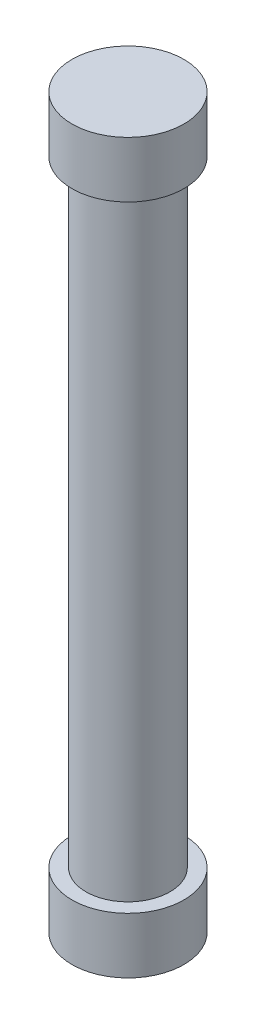
ISO-10303-21;
HEADER;
FILE_DESCRIPTION(('STEP AP214'),'2;1');
FILE_NAME('part.step','',(''),(''),'','','');
FILE_SCHEMA(('AUTOMOTIVE_DESIGN { 1 0 10303 214 1 1 1 1 }'));
ENDSEC;
DATA;
#1=APPLICATION_CONTEXT('core data for automotive mechanical design processes');
#2=APPLICATION_PROTOCOL_DEFINITION('international standard','automotive_design',2000,#1);
#3=PRODUCT_CONTEXT('',#1,'mechanical');
#4=PRODUCT('Part','Part','',(#3));
#5=PRODUCT_RELATED_PRODUCT_CATEGORY('part','',(#4));
#6=PRODUCT_DEFINITION_FORMATION('','',#4);
#7=PRODUCT_DEFINITION_CONTEXT('part definition',#1,'design');
#8=PRODUCT_DEFINITION('design','',#6,#7);
#9=PRODUCT_DEFINITION_SHAPE('','',#8);
#10=(LENGTH_UNIT() NAMED_UNIT(*) SI_UNIT(.MILLI.,.METRE.));
#11=(NAMED_UNIT(*) PLANE_ANGLE_UNIT() SI_UNIT($,.RADIAN.));
#12=(NAMED_UNIT(*) SI_UNIT($,.STERADIAN.) SOLID_ANGLE_UNIT());
#13=UNCERTAINTY_MEASURE_WITH_UNIT(LENGTH_MEASURE(1.E-05),#10,'distance_accuracy_value','');
#14=(GEOMETRIC_REPRESENTATION_CONTEXT(3) GLOBAL_UNCERTAINTY_ASSIGNED_CONTEXT((#13)) GLOBAL_UNIT_ASSIGNED_CONTEXT((#10,
#11,#12)) REPRESENTATION_CONTEXT('',''));
#15=CARTESIAN_POINT('',(0.,0.,0.));
#16=DIRECTION('',(0.,0.,1.));
#17=DIRECTION('',(1.,0.,0.));
#18=AXIS2_PLACEMENT_3D('',#15,#16,#17);
#19=CARTESIAN_POINT('',(-2.,20.9564457796013,0.));
#20=DIRECTION('',(0.,1.,0.));
#21=DIRECTION('',(-1.,0.,0.));
#22=AXIS2_PLACEMENT_3D('',#19,#20,#21);
#23=PLANE('',#22);
#24=CARTESIAN_POINT('',(0.,20.9564457796013,0.));
#25=DIRECTION('',(0.,1.,0.));
#26=DIRECTION('',(-1.,0.,0.));
#27=AXIS2_PLACEMENT_3D('',#24,#25,#26);
#28=CIRCLE('',#27,2.);
#29=CARTESIAN_POINT('',(-2.,20.9564457796013,0.));
#30=VERTEX_POINT('',#29);
#31=EDGE_CURVE('E68',#30,#30,#28,.T.);
#32=ORIENTED_EDGE('',*,*,#31,.T.);
#33=EDGE_LOOP('',(#32));
#34=FACE_BOUND('',#33,.T.);
#35=ADVANCED_FACE('F41',(#34),#23,.T.);
#36=CARTESIAN_POINT('',(0.,-5.0435542203987,0.));
#37=DIRECTION('',(0.,-1.,0.));
#38=DIRECTION('',(1.,0.,0.));
#39=AXIS2_PLACEMENT_3D('',#36,#37,#38);
#40=PLANE('',#39);
#41=CARTESIAN_POINT('',(0.,-5.0435542203987,0.));
#42=DIRECTION('',(0.,1.,0.));
#43=DIRECTION('',(-1.,0.,0.));
#44=AXIS2_PLACEMENT_3D('',#41,#42,#43);
#45=CIRCLE('',#44,2.);
#46=CARTESIAN_POINT('',(-2.,-5.0435542203987,0.));
#47=VERTEX_POINT('',#46);
#48=EDGE_CURVE('E10',#47,#47,#45,.T.);
#49=ORIENTED_EDGE('',*,*,#48,.F.);
#50=EDGE_LOOP('',(#49));
#51=FACE_BOUND('',#50,.T.);
#52=ADVANCED_FACE('F86',(#51),#40,.T.);
#53=CARTESIAN_POINT('',(0.,20.9564457796013,0.));
#54=DIRECTION('',(0.,1.,0.));
#55=DIRECTION('',(-1.,0.,0.));
#56=AXIS2_PLACEMENT_3D('',#53,#54,#55);
#57=CYLINDRICAL_SURFACE('',#56,2.);
#58=ORIENTED_EDGE('',*,*,#48,.T.);
#59=EDGE_LOOP('',(#58));
#60=FACE_BOUND('',#59,.T.);
#61=CARTESIAN_POINT('',(0.,-3.0435542203987,0.));
#62=DIRECTION('',(0.,1.,0.));
#63=DIRECTION('',(-1.,0.,0.));
#64=AXIS2_PLACEMENT_3D('',#61,#62,#63);
#65=CIRCLE('',#64,2.);
#66=CARTESIAN_POINT('',(-2.,-3.0435542203987,0.));
#67=VERTEX_POINT('',#66);
#68=EDGE_CURVE('E48',#67,#67,#65,.T.);
#69=ORIENTED_EDGE('',*,*,#68,.F.);
#70=EDGE_LOOP('',(#69));
#71=FACE_BOUND('',#70,.T.);
#72=ADVANCED_FACE('F90',(#60,#71),#57,.T.);
#73=CARTESIAN_POINT('',(-2.,-3.0435542203987,0.));
#74=DIRECTION('',(0.,1.,0.));
#75=DIRECTION('',(-1.,0.,0.));
#76=AXIS2_PLACEMENT_3D('',#73,#74,#75);
#77=PLANE('',#76);
#78=ORIENTED_EDGE('',*,*,#68,.T.);
#79=EDGE_LOOP('',(#78));
#80=FACE_BOUND('',#79,.T.);
#81=CARTESIAN_POINT('',(0.,-3.0435542203987,0.));
#82=DIRECTION('',(0.,1.,0.));
#83=DIRECTION('',(-1.,0.,0.));
#84=AXIS2_PLACEMENT_3D('',#81,#82,#83);
#85=CIRCLE('',#84,1.5);
#86=CARTESIAN_POINT('',(-1.5,-3.0435542203987,0.));
#87=VERTEX_POINT('',#86);
#88=EDGE_CURVE('E53',#87,#87,#85,.T.);
#89=ORIENTED_EDGE('',*,*,#88,.F.);
#90=EDGE_LOOP('',(#89));
#91=FACE_BOUND('',#90,.T.);
#92=ADVANCED_FACE('F95',(#80,#91),#77,.T.);
#93=CARTESIAN_POINT('',(0.,20.9564457796013,0.));
#94=DIRECTION('',(0.,1.,0.));
#95=DIRECTION('',(-1.,0.,0.));
#96=AXIS2_PLACEMENT_3D('',#93,#94,#95);
#97=CYLINDRICAL_SURFACE('',#96,1.5);
#98=ORIENTED_EDGE('',*,*,#88,.T.);
#99=EDGE_LOOP('',(#98));
#100=FACE_BOUND('',#99,.T.);
#101=CARTESIAN_POINT('',(0.,18.9564457796013,0.));
#102=DIRECTION('',(0.,1.,0.));
#103=DIRECTION('',(-1.,0.,0.));
#104=AXIS2_PLACEMENT_3D('',#101,#102,#103);
#105=CIRCLE('',#104,1.5);
#106=CARTESIAN_POINT('',(-1.5,18.9564457796013,0.));
#107=VERTEX_POINT('',#106);
#108=EDGE_CURVE('E58',#107,#107,#105,.T.);
#109=ORIENTED_EDGE('',*,*,#108,.F.);
#110=EDGE_LOOP('',(#109));
#111=FACE_BOUND('',#110,.T.);
#112=ADVANCED_FACE('F82',(#100,#111),#97,.T.);
#113=CARTESIAN_POINT('',(-1.5,18.9564457796013,0.));
#114=DIRECTION('',(0.,-1.,0.));
#115=DIRECTION('',(1.,0.,0.));
#116=AXIS2_PLACEMENT_3D('',#113,#114,#115);
#117=PLANE('',#116);
#118=ORIENTED_EDGE('',*,*,#108,.T.);
#119=EDGE_LOOP('',(#118));
#120=FACE_BOUND('',#119,.T.);
#121=CARTESIAN_POINT('',(0.,18.9564457796013,0.));
#122=DIRECTION('',(0.,1.,0.));
#123=DIRECTION('',(-1.,0.,0.));
#124=AXIS2_PLACEMENT_3D('',#121,#122,#123);
#125=CIRCLE('',#124,2.);
#126=CARTESIAN_POINT('',(-2.,18.9564457796013,0.));
#127=VERTEX_POINT('',#126);
#128=EDGE_CURVE('E64',#127,#127,#125,.T.);
#129=ORIENTED_EDGE('',*,*,#128,.F.);
#130=EDGE_LOOP('',(#129));
#131=FACE_BOUND('',#130,.T.);
#132=ADVANCED_FACE('F76',(#120,#131),#117,.T.);
#133=CARTESIAN_POINT('',(0.,20.9564457796013,0.));
#134=DIRECTION('',(0.,1.,0.));
#135=DIRECTION('',(-1.,0.,0.));
#136=AXIS2_PLACEMENT_3D('',#133,#134,#135);
#137=CYLINDRICAL_SURFACE('',#136,2.);
#138=ORIENTED_EDGE('',*,*,#128,.T.);
#139=EDGE_LOOP('',(#138));
#140=FACE_BOUND('',#139,.T.);
#141=ORIENTED_EDGE('',*,*,#31,.F.);
#142=EDGE_LOOP('',(#141));
#143=FACE_BOUND('',#142,.T.);
#144=ADVANCED_FACE('F74',(#140,#143),#137,.T.);
#145=CLOSED_SHELL('',(#35,#52,#72,#92,#112,#132,#144));
#146=MANIFOLD_SOLID_BREP('B2',#145);
#147=ADVANCED_BREP_SHAPE_REPRESENTATION('',(#18,#146),#14);
#148=SHAPE_DEFINITION_REPRESENTATION(#9,#147);
ENDSEC;
END-ISO-10303-21;
